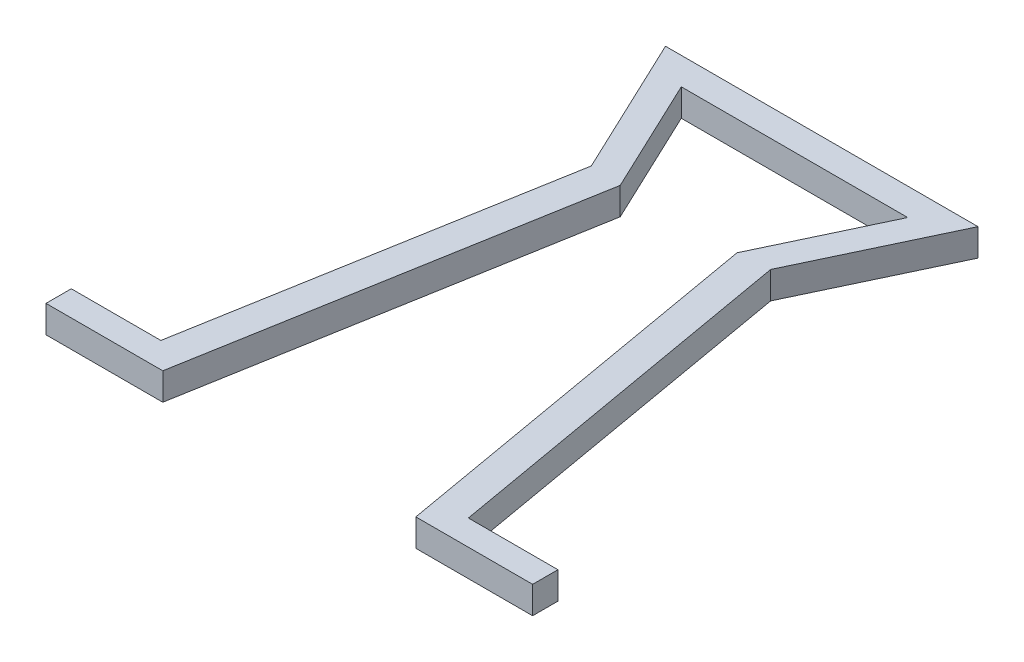
ISO-10303-21;
HEADER;
FILE_DESCRIPTION(('STEP AP214'),'2;1');
FILE_NAME('part.step','',(''),(''),'','','');
FILE_SCHEMA(('AUTOMOTIVE_DESIGN { 1 0 10303 214 1 1 1 1 }'));
ENDSEC;
DATA;
#1=APPLICATION_CONTEXT('core data for automotive mechanical design processes');
#2=APPLICATION_PROTOCOL_DEFINITION('international standard','automotive_design',2000,#1);
#3=PRODUCT_CONTEXT('',#1,'mechanical');
#4=PRODUCT('Part','Part','',(#3));
#5=PRODUCT_RELATED_PRODUCT_CATEGORY('part','',(#4));
#6=PRODUCT_DEFINITION_FORMATION('','',#4);
#7=PRODUCT_DEFINITION_CONTEXT('part definition',#1,'design');
#8=PRODUCT_DEFINITION('design','',#6,#7);
#9=PRODUCT_DEFINITION_SHAPE('','',#8);
#10=(LENGTH_UNIT() NAMED_UNIT(*) SI_UNIT(.MILLI.,.METRE.));
#11=(NAMED_UNIT(*) PLANE_ANGLE_UNIT() SI_UNIT($,.RADIAN.));
#12=(NAMED_UNIT(*) SI_UNIT($,.STERADIAN.) SOLID_ANGLE_UNIT());
#13=UNCERTAINTY_MEASURE_WITH_UNIT(LENGTH_MEASURE(1.E-05),#10,'distance_accuracy_value','');
#14=(GEOMETRIC_REPRESENTATION_CONTEXT(3) GLOBAL_UNCERTAINTY_ASSIGNED_CONTEXT((#13)) GLOBAL_UNIT_ASSIGNED_CONTEXT((#10,
#11,#12)) REPRESENTATION_CONTEXT('',''));
#15=CARTESIAN_POINT('',(0.,0.,0.));
#16=DIRECTION('',(0.,0.,1.));
#17=DIRECTION('',(1.,0.,0.));
#18=AXIS2_PLACEMENT_3D('',#15,#16,#17);
#19=CARTESIAN_POINT('',(-15.24,1.778,-1.651));
#20=DIRECTION('',(1.,0.,0.));
#21=DIRECTION('',(0.,0.,-1.));
#22=AXIS2_PLACEMENT_3D('',#19,#20,#21);
#23=PLANE('',#22);
#24=DIRECTION('',(0.,0.,1.));
#25=VECTOR('',#24,1.);
#26=CARTESIAN_POINT('',(-15.24,0.,-1.651));
#27=LINE('',#26,#25);
#28=CARTESIAN_POINT('',(-15.24,0.,-1.651));
#29=VERTEX_POINT('',#28);
#30=CARTESIAN_POINT('',(-15.24,0.,0.));
#31=VERTEX_POINT('',#30);
#32=EDGE_CURVE('E188',#29,#31,#27,.T.);
#33=ORIENTED_EDGE('',*,*,#32,.T.);
#34=DIRECTION('',(0.,-1.,0.));
#35=VECTOR('',#34,1.);
#36=CARTESIAN_POINT('',(-15.24,1.778,0.));
#37=LINE('',#36,#35);
#38=CARTESIAN_POINT('',(-15.24,1.778,0.));
#39=VERTEX_POINT('',#38);
#40=EDGE_CURVE('E11',#39,#31,#37,.T.);
#41=ORIENTED_EDGE('',*,*,#40,.F.);
#42=DIRECTION('',(0.,0.,1.));
#43=VECTOR('',#42,1.);
#44=CARTESIAN_POINT('',(-15.24,1.778,-1.651));
#45=LINE('',#44,#43);
#46=CARTESIAN_POINT('',(-15.24,1.778,-1.651));
#47=VERTEX_POINT('',#46);
#48=EDGE_CURVE('E234',#47,#39,#45,.T.);
#49=ORIENTED_EDGE('',*,*,#48,.F.);
#50=DIRECTION('',(0.,-1.,0.));
#51=VECTOR('',#50,1.);
#52=CARTESIAN_POINT('',(-15.24,1.778,-1.651));
#53=LINE('',#52,#51);
#54=EDGE_CURVE('E184',#47,#29,#53,.T.);
#55=ORIENTED_EDGE('',*,*,#54,.T.);
#56=EDGE_LOOP('',(#33,#41,#49,#55));
#57=FACE_BOUND('',#56,.T.);
#58=ADVANCED_FACE('F39',(#57),#23,.F.);
#59=CARTESIAN_POINT('',(-15.24,1.778,0.));
#60=DIRECTION('',(0.,0.,-1.));
#61=DIRECTION('',(-1.,0.,0.));
#62=AXIS2_PLACEMENT_3D('',#59,#60,#61);
#63=PLANE('',#62);
#64=DIRECTION('',(1.,0.,0.));
#65=VECTOR('',#64,1.);
#66=CARTESIAN_POINT('',(-15.24,0.,0.));
#67=LINE('',#66,#65);
#68=CARTESIAN_POINT('',(-7.62,0.,0.));
#69=VERTEX_POINT('',#68);
#70=EDGE_CURVE('E192',#31,#69,#67,.T.);
#71=ORIENTED_EDGE('',*,*,#70,.T.);
#72=DIRECTION('',(0.,-1.,0.));
#73=VECTOR('',#72,1.);
#74=CARTESIAN_POINT('',(-7.62,1.778,0.));
#75=LINE('',#74,#73);
#76=CARTESIAN_POINT('',(-7.62,1.778,0.));
#77=VERTEX_POINT('',#76);
#78=EDGE_CURVE('E48',#77,#69,#75,.T.);
#79=ORIENTED_EDGE('',*,*,#78,.F.);
#80=DIRECTION('',(1.,0.,0.));
#81=VECTOR('',#80,1.);
#82=CARTESIAN_POINT('',(-15.24,1.778,0.));
#83=LINE('',#82,#81);
#84=EDGE_CURVE('E123',#39,#77,#83,.T.);
#85=ORIENTED_EDGE('',*,*,#84,.F.);
#86=ORIENTED_EDGE('',*,*,#40,.T.);
#87=EDGE_LOOP('',(#71,#79,#85,#86));
#88=FACE_BOUND('',#87,.T.);
#89=ADVANCED_FACE('F356',(#88),#63,.F.);
#90=CARTESIAN_POINT('',(-7.62,1.778,0.));
#91=DIRECTION('',(-0.985030467155704,0.,-0.172380331752248));
#92=DIRECTION('',(-0.172380331752248,0.,0.985030467155704));
#93=AXIS2_PLACEMENT_3D('',#90,#91,#92);
#94=PLANE('',#93);
#95=DIRECTION('',(0.172380331752248,0.,-0.985030467155704));
#96=VECTOR('',#95,1.);
#97=CARTESIAN_POINT('',(-7.62,0.,0.));
#98=LINE('',#97,#96);
#99=CARTESIAN_POINT('',(-3.175,0.,-25.4));
#100=VERTEX_POINT('',#99);
#101=EDGE_CURVE('E195',#69,#100,#98,.T.);
#102=ORIENTED_EDGE('',*,*,#101,.T.);
#103=DIRECTION('',(0.,-1.,0.));
#104=VECTOR('',#103,1.);
#105=CARTESIAN_POINT('',(-3.175,1.778,-25.4));
#106=LINE('',#105,#104);
#107=CARTESIAN_POINT('',(-3.175,1.778,-25.4));
#108=VERTEX_POINT('',#107);
#109=EDGE_CURVE('E277',#108,#100,#106,.T.);
#110=ORIENTED_EDGE('',*,*,#109,.F.);
#111=DIRECTION('',(0.172380331752248,0.,-0.985030467155704));
#112=VECTOR('',#111,1.);
#113=CARTESIAN_POINT('',(-7.62,1.778,0.));
#114=LINE('',#113,#112);
#115=EDGE_CURVE('E287',#77,#108,#114,.T.);
#116=ORIENTED_EDGE('',*,*,#115,.F.);
#117=ORIENTED_EDGE('',*,*,#78,.T.);
#118=EDGE_LOOP('',(#102,#110,#116,#117));
#119=FACE_BOUND('',#118,.T.);
#120=ADVANCED_FACE('F285',(#119),#94,.F.);
#121=CARTESIAN_POINT('',(-3.175,1.778,-25.4));
#122=DIRECTION('',(-0.903960632583604,0.,0.427615685796312));
#123=DIRECTION('',(0.427615685796312,0.,0.903960632583604));
#124=AXIS2_PLACEMENT_3D('',#121,#122,#123);
#125=PLANE('',#124);
#126=DIRECTION('',(-0.427615685796312,0.,-0.903960632583604));
#127=VECTOR('',#126,1.);
#128=CARTESIAN_POINT('',(-3.175,0.,-25.4));
#129=LINE('',#128,#127);
#130=CARTESIAN_POINT('',(-6.75151231719064,0.,-32.9605887344149));
#131=VERTEX_POINT('',#130);
#132=EDGE_CURVE('E198',#100,#131,#129,.T.);
#133=ORIENTED_EDGE('',*,*,#132,.T.);
#134=DIRECTION('',(0.,-1.,0.));
#135=VECTOR('',#134,1.);
#136=CARTESIAN_POINT('',(-6.75151231719064,1.778,-32.9605887344149));
#137=LINE('',#136,#135);
#138=CARTESIAN_POINT('',(-6.75151231719064,1.778,-32.9605887344149));
#139=VERTEX_POINT('',#138);
#140=EDGE_CURVE('E273',#139,#131,#137,.T.);
#141=ORIENTED_EDGE('',*,*,#140,.F.);
#142=DIRECTION('',(-0.427615685796312,0.,-0.903960632583604));
#143=VECTOR('',#142,1.);
#144=CARTESIAN_POINT('',(-3.175,1.778,-25.4));
#145=LINE('',#144,#143);
#146=EDGE_CURVE('E306',#108,#139,#145,.T.);
#147=ORIENTED_EDGE('',*,*,#146,.F.);
#148=ORIENTED_EDGE('',*,*,#109,.T.);
#149=EDGE_LOOP('',(#133,#141,#147,#148));
#150=FACE_BOUND('',#149,.T.);
#151=ADVANCED_FACE('F296',(#150),#125,.F.);
#152=CARTESIAN_POINT('',(8.02151231719064,1.778,-32.9605887344149));
#153=DIRECTION('',(0.,0.,-1.));
#154=DIRECTION('',(-1.,0.,0.));
#155=AXIS2_PLACEMENT_3D('',#152,#153,#154);
#156=PLANE('',#155);
#157=DIRECTION('',(1.,0.,0.));
#158=VECTOR('',#157,1.);
#159=CARTESIAN_POINT('',(8.02151231719064,0.,-32.9605887344149));
#160=LINE('',#159,#158);
#161=CARTESIAN_POINT('',(8.02151231719064,0.,-32.9605887344149));
#162=VERTEX_POINT('',#161);
#163=EDGE_CURVE('E201',#131,#162,#160,.T.);
#164=ORIENTED_EDGE('',*,*,#163,.T.);
#165=DIRECTION('',(0.,-1.,0.));
#166=VECTOR('',#165,1.);
#167=CARTESIAN_POINT('',(8.02151231719064,1.778,-32.9605887344149));
#168=LINE('',#167,#166);
#169=CARTESIAN_POINT('',(8.02151231719064,1.778,-32.9605887344149));
#170=VERTEX_POINT('',#169);
#171=EDGE_CURVE('E269',#170,#162,#168,.T.);
#172=ORIENTED_EDGE('',*,*,#171,.F.);
#173=DIRECTION('',(1.,0.,0.));
#174=VECTOR('',#173,1.);
#175=CARTESIAN_POINT('',(8.02151231719064,1.778,-32.9605887344149));
#176=LINE('',#175,#174);
#177=EDGE_CURVE('E302',#139,#170,#176,.T.);
#178=ORIENTED_EDGE('',*,*,#177,.F.);
#179=ORIENTED_EDGE('',*,*,#140,.T.);
#180=EDGE_LOOP('',(#164,#172,#178,#179));
#181=FACE_BOUND('',#180,.T.);
#182=ADVANCED_FACE('F300',(#181),#156,.F.);
#183=CARTESIAN_POINT('',(4.445,1.778,-25.4));
#184=DIRECTION('',(0.903960632583604,0.,0.427615685796312));
#185=DIRECTION('',(0.427615685796312,0.,-0.903960632583604));
#186=AXIS2_PLACEMENT_3D('',#183,#184,#185);
#187=PLANE('',#186);
#188=DIRECTION('',(-0.427615685796312,0.,0.903960632583604));
#189=VECTOR('',#188,1.);
#190=CARTESIAN_POINT('',(4.445,0.,-25.4));
#191=LINE('',#190,#189);
#192=CARTESIAN_POINT('',(4.445,0.,-25.4));
#193=VERTEX_POINT('',#192);
#194=EDGE_CURVE('E204',#162,#193,#191,.T.);
#195=ORIENTED_EDGE('',*,*,#194,.T.);
#196=DIRECTION('',(0.,-1.,0.));
#197=VECTOR('',#196,1.);
#198=CARTESIAN_POINT('',(4.445,1.778,-25.4));
#199=LINE('',#198,#197);
#200=CARTESIAN_POINT('',(4.445,1.778,-25.4));
#201=VERTEX_POINT('',#200);
#202=EDGE_CURVE('E265',#201,#193,#199,.T.);
#203=ORIENTED_EDGE('',*,*,#202,.F.);
#204=DIRECTION('',(-0.427615685796312,0.,0.903960632583604));
#205=VECTOR('',#204,1.);
#206=CARTESIAN_POINT('',(4.445,1.778,-25.4));
#207=LINE('',#206,#205);
#208=EDGE_CURVE('E305',#170,#201,#207,.T.);
#209=ORIENTED_EDGE('',*,*,#208,.F.);
#210=ORIENTED_EDGE('',*,*,#171,.T.);
#211=EDGE_LOOP('',(#195,#203,#209,#210));
#212=FACE_BOUND('',#211,.T.);
#213=ADVANCED_FACE('F369',(#212),#187,.F.);
#214=CARTESIAN_POINT('',(4.445,1.778,-25.4));
#215=DIRECTION('',(0.985030467155704,0.,-0.172380331752248));
#216=DIRECTION('',(-0.172380331752248,0.,-0.985030467155704));
#217=AXIS2_PLACEMENT_3D('',#214,#215,#216);
#218=PLANE('',#217);
#219=DIRECTION('',(0.172380331752248,0.,0.985030467155704));
#220=VECTOR('',#219,1.);
#221=CARTESIAN_POINT('',(4.445,0.,-25.4));
#222=LINE('',#221,#220);
#223=CARTESIAN_POINT('',(8.89,0.,0.));
#224=VERTEX_POINT('',#223);
#225=EDGE_CURVE('E207',#193,#224,#222,.T.);
#226=ORIENTED_EDGE('',*,*,#225,.T.);
#227=DIRECTION('',(0.,-1.,0.));
#228=VECTOR('',#227,1.);
#229=CARTESIAN_POINT('',(8.89,1.778,0.));
#230=LINE('',#229,#228);
#231=CARTESIAN_POINT('',(8.89,1.778,0.));
#232=VERTEX_POINT('',#231);
#233=EDGE_CURVE('E261',#232,#224,#230,.T.);
#234=ORIENTED_EDGE('',*,*,#233,.F.);
#235=DIRECTION('',(0.172380331752248,0.,0.985030467155704));
#236=VECTOR('',#235,1.);
#237=CARTESIAN_POINT('',(4.445,1.778,-25.4));
#238=LINE('',#237,#236);
#239=EDGE_CURVE('E310',#201,#232,#238,.T.);
#240=ORIENTED_EDGE('',*,*,#239,.F.);
#241=ORIENTED_EDGE('',*,*,#202,.T.);
#242=EDGE_LOOP('',(#226,#234,#240,#241));
#243=FACE_BOUND('',#242,.T.);
#244=ADVANCED_FACE('F372',(#243),#218,.F.);
#245=CARTESIAN_POINT('',(8.89,1.778,0.));
#246=DIRECTION('',(0.,0.,-1.));
#247=DIRECTION('',(-1.,0.,0.));
#248=AXIS2_PLACEMENT_3D('',#245,#246,#247);
#249=PLANE('',#248);
#250=DIRECTION('',(1.,0.,0.));
#251=VECTOR('',#250,1.);
#252=CARTESIAN_POINT('',(8.89,0.,0.));
#253=LINE('',#252,#251);
#254=CARTESIAN_POINT('',(16.51,0.,0.));
#255=VERTEX_POINT('',#254);
#256=EDGE_CURVE('E210',#224,#255,#253,.T.);
#257=ORIENTED_EDGE('',*,*,#256,.T.);
#258=DIRECTION('',(0.,-1.,0.));
#259=VECTOR('',#258,1.);
#260=CARTESIAN_POINT('',(16.51,1.778,0.));
#261=LINE('',#260,#259);
#262=CARTESIAN_POINT('',(16.51,1.778,0.));
#263=VERTEX_POINT('',#262);
#264=EDGE_CURVE('E257',#263,#255,#261,.T.);
#265=ORIENTED_EDGE('',*,*,#264,.F.);
#266=DIRECTION('',(1.,0.,0.));
#267=VECTOR('',#266,1.);
#268=CARTESIAN_POINT('',(8.89,1.778,0.));
#269=LINE('',#268,#267);
#270=EDGE_CURVE('E317',#232,#263,#269,.T.);
#271=ORIENTED_EDGE('',*,*,#270,.F.);
#272=ORIENTED_EDGE('',*,*,#233,.T.);
#273=EDGE_LOOP('',(#257,#265,#271,#272));
#274=FACE_BOUND('',#273,.T.);
#275=ADVANCED_FACE('F376',(#274),#249,.F.);
#276=CARTESIAN_POINT('',(16.51,1.778,0.));
#277=DIRECTION('',(-1.,0.,0.));
#278=DIRECTION('',(0.,0.,1.));
#279=AXIS2_PLACEMENT_3D('',#276,#277,#278);
#280=PLANE('',#279);
#281=DIRECTION('',(0.,0.,-1.));
#282=VECTOR('',#281,1.);
#283=CARTESIAN_POINT('',(16.51,0.,0.));
#284=LINE('',#283,#282);
#285=CARTESIAN_POINT('',(16.51,0.,-1.651));
#286=VERTEX_POINT('',#285);
#287=EDGE_CURVE('E213',#255,#286,#284,.T.);
#288=ORIENTED_EDGE('',*,*,#287,.T.);
#289=DIRECTION('',(0.,-1.,0.));
#290=VECTOR('',#289,1.);
#291=CARTESIAN_POINT('',(16.51,1.778,-1.651));
#292=LINE('',#291,#290);
#293=CARTESIAN_POINT('',(16.51,1.778,-1.651));
#294=VERTEX_POINT('',#293);
#295=EDGE_CURVE('E253',#294,#286,#292,.T.);
#296=ORIENTED_EDGE('',*,*,#295,.F.);
#297=DIRECTION('',(0.,0.,-1.));
#298=VECTOR('',#297,1.);
#299=CARTESIAN_POINT('',(16.51,1.778,0.));
#300=LINE('',#299,#298);
#301=EDGE_CURVE('E320',#263,#294,#300,.T.);
#302=ORIENTED_EDGE('',*,*,#301,.F.);
#303=ORIENTED_EDGE('',*,*,#264,.T.);
#304=EDGE_LOOP('',(#288,#296,#302,#303));
#305=FACE_BOUND('',#304,.T.);
#306=ADVANCED_FACE('F380',(#305),#280,.F.);
#307=CARTESIAN_POINT('',(16.51,1.778,-1.651));
#308=DIRECTION('',(0.,0.,1.));
#309=DIRECTION('',(1.,0.,0.));
#310=AXIS2_PLACEMENT_3D('',#307,#308,#309);
#311=PLANE('',#310);
#312=DIRECTION('',(-1.,0.,0.));
#313=VECTOR('',#312,1.);
#314=CARTESIAN_POINT('',(16.51,0.,-1.651));
#315=LINE('',#314,#313);
#316=CARTESIAN_POINT('',(10.668,0.,-1.651));
#317=VERTEX_POINT('',#316);
#318=EDGE_CURVE('E216',#286,#317,#315,.T.);
#319=ORIENTED_EDGE('',*,*,#318,.T.);
#320=DIRECTION('',(0.,-1.,0.));
#321=VECTOR('',#320,1.);
#322=CARTESIAN_POINT('',(10.668,1.778,-1.651));
#323=LINE('',#322,#321);
#324=CARTESIAN_POINT('',(10.668,1.778,-1.651));
#325=VERTEX_POINT('',#324);
#326=EDGE_CURVE('E249',#325,#317,#323,.T.);
#327=ORIENTED_EDGE('',*,*,#326,.F.);
#328=DIRECTION('',(-1.,0.,0.));
#329=VECTOR('',#328,1.);
#330=CARTESIAN_POINT('',(16.51,1.778,-1.651));
#331=LINE('',#330,#329);
#332=EDGE_CURVE('E323',#294,#325,#331,.T.);
#333=ORIENTED_EDGE('',*,*,#332,.F.);
#334=ORIENTED_EDGE('',*,*,#295,.T.);
#335=EDGE_LOOP('',(#319,#327,#333,#334));
#336=FACE_BOUND('',#335,.T.);
#337=ADVANCED_FACE('F384',(#336),#311,.F.);
#338=CARTESIAN_POINT('',(10.668,1.778,-1.651));
#339=DIRECTION('',(-0.985030467155704,0.,0.172380331752248));
#340=DIRECTION('',(0.172380331752248,0.,0.985030467155704));
#341=AXIS2_PLACEMENT_3D('',#338,#339,#340);
#342=PLANE('',#341);
#343=DIRECTION('',(-0.172380331752248,0.,-0.985030467155704));
#344=VECTOR('',#343,1.);
#345=CARTESIAN_POINT('',(10.668,0.,-1.651));
#346=LINE('',#345,#344);
#347=CARTESIAN_POINT('',(6.48491397621103,0.,-25.5543487073655));
#348=VERTEX_POINT('',#347);
#349=EDGE_CURVE('E219',#317,#348,#346,.T.);
#350=ORIENTED_EDGE('',*,*,#349,.T.);
#351=DIRECTION('',(0.,-1.,0.));
#352=VECTOR('',#351,1.);
#353=CARTESIAN_POINT('',(6.48491397621103,1.778,-25.5543487073655));
#354=LINE('',#353,#352);
#355=CARTESIAN_POINT('',(6.48491397621103,1.778,-25.5543487073655));
#356=VERTEX_POINT('',#355);
#357=EDGE_CURVE('E245',#356,#348,#354,.T.);
#358=ORIENTED_EDGE('',*,*,#357,.F.);
#359=DIRECTION('',(-0.172380331752248,0.,-0.985030467155704));
#360=VECTOR('',#359,1.);
#361=CARTESIAN_POINT('',(10.668,1.778,-1.651));
#362=LINE('',#361,#360);
#363=EDGE_CURVE('E326',#325,#356,#362,.T.);
#364=ORIENTED_EDGE('',*,*,#363,.F.);
#365=ORIENTED_EDGE('',*,*,#326,.T.);
#366=EDGE_LOOP('',(#350,#358,#364,#365));
#367=FACE_BOUND('',#366,.T.);
#368=ADVANCED_FACE('F388',(#367),#342,.F.);
#369=CARTESIAN_POINT('',(6.48491397621103,1.778,-25.5543487073655));
#370=DIRECTION('',(-0.903960632583604,0.,-0.427615685796312));
#371=DIRECTION('',(-0.427615685796312,0.,0.903960632583604));
#372=AXIS2_PLACEMENT_3D('',#369,#370,#371);
#373=PLANE('',#372);
#374=DIRECTION('',(0.427615685796312,0.,-0.903960632583604));
#375=VECTOR('',#374,1.);
#376=CARTESIAN_POINT('',(6.48491397621103,0.,-25.5543487073655));
#377=LINE('',#376,#375);
#378=CARTESIAN_POINT('',(10.8294893439016,0.,-34.7385887344149));
#379=VERTEX_POINT('',#378);
#380=EDGE_CURVE('E222',#348,#379,#377,.T.);
#381=ORIENTED_EDGE('',*,*,#380,.T.);
#382=DIRECTION('',(0.,-1.,0.));
#383=VECTOR('',#382,1.);
#384=CARTESIAN_POINT('',(10.8294893439016,1.778,-34.7385887344149));
#385=LINE('',#384,#383);
#386=CARTESIAN_POINT('',(10.8294893439016,1.778,-34.7385887344149));
#387=VERTEX_POINT('',#386);
#388=EDGE_CURVE('E241',#387,#379,#385,.T.);
#389=ORIENTED_EDGE('',*,*,#388,.F.);
#390=DIRECTION('',(0.427615685796312,0.,-0.903960632583604));
#391=VECTOR('',#390,1.);
#392=CARTESIAN_POINT('',(6.48491397621103,1.778,-25.5543487073655));
#393=LINE('',#392,#391);
#394=EDGE_CURVE('E329',#356,#387,#393,.T.);
#395=ORIENTED_EDGE('',*,*,#394,.F.);
#396=ORIENTED_EDGE('',*,*,#357,.T.);
#397=EDGE_LOOP('',(#381,#389,#395,#396));
#398=FACE_BOUND('',#397,.T.);
#399=ADVANCED_FACE('F337',(#398),#373,.F.);
#400=CARTESIAN_POINT('',(-9.55948934390157,1.778,-34.7385887344149));
#401=DIRECTION('',(0.,0.,1.));
#402=DIRECTION('',(1.,0.,0.));
#403=AXIS2_PLACEMENT_3D('',#400,#401,#402);
#404=PLANE('',#403);
#405=DIRECTION('',(-1.,0.,0.));
#406=VECTOR('',#405,1.);
#407=CARTESIAN_POINT('',(-9.55948934390157,0.,-34.7385887344149));
#408=LINE('',#407,#406);
#409=CARTESIAN_POINT('',(-9.55948934390157,0.,-34.7385887344149));
#410=VERTEX_POINT('',#409);
#411=EDGE_CURVE('E225',#379,#410,#408,.T.);
#412=ORIENTED_EDGE('',*,*,#411,.T.);
#413=DIRECTION('',(0.,-1.,0.));
#414=VECTOR('',#413,1.);
#415=CARTESIAN_POINT('',(-9.55948934390157,1.778,-34.7385887344149));
#416=LINE('',#415,#414);
#417=CARTESIAN_POINT('',(-9.55948934390157,1.778,-34.7385887344149));
#418=VERTEX_POINT('',#417);
#419=EDGE_CURVE('E177',#418,#410,#416,.T.);
#420=ORIENTED_EDGE('',*,*,#419,.F.);
#421=DIRECTION('',(-1.,0.,0.));
#422=VECTOR('',#421,1.);
#423=CARTESIAN_POINT('',(-9.55948934390157,1.778,-34.7385887344149));
#424=LINE('',#423,#422);
#425=EDGE_CURVE('E166',#387,#418,#424,.T.);
#426=ORIENTED_EDGE('',*,*,#425,.F.);
#427=ORIENTED_EDGE('',*,*,#388,.T.);
#428=EDGE_LOOP('',(#412,#420,#426,#427));
#429=FACE_BOUND('',#428,.T.);
#430=ADVANCED_FACE('F341',(#429),#404,.F.);
#431=CARTESIAN_POINT('',(-5.21491397621104,1.778,-25.5543487073655));
#432=DIRECTION('',(0.903960632583604,0.,-0.427615685796312));
#433=DIRECTION('',(-0.427615685796312,0.,-0.903960632583604));
#434=AXIS2_PLACEMENT_3D('',#431,#432,#433);
#435=PLANE('',#434);
#436=DIRECTION('',(0.427615685796312,0.,0.903960632583604));
#437=VECTOR('',#436,1.);
#438=CARTESIAN_POINT('',(-5.21491397621104,0.,-25.5543487073655));
#439=LINE('',#438,#437);
#440=CARTESIAN_POINT('',(-5.21491397621104,0.,-25.5543487073655));
#441=VERTEX_POINT('',#440);
#442=EDGE_CURVE('E175',#410,#441,#439,.T.);
#443=ORIENTED_EDGE('',*,*,#442,.T.);
#444=DIRECTION('',(0.,-1.,0.));
#445=VECTOR('',#444,1.);
#446=CARTESIAN_POINT('',(-5.21491397621104,1.778,-25.5543487073655));
#447=LINE('',#446,#445);
#448=CARTESIAN_POINT('',(-5.21491397621104,1.778,-25.5543487073655));
#449=VERTEX_POINT('',#448);
#450=EDGE_CURVE('E172',#449,#441,#447,.T.);
#451=ORIENTED_EDGE('',*,*,#450,.F.);
#452=DIRECTION('',(0.427615685796312,0.,0.903960632583604));
#453=VECTOR('',#452,1.);
#454=CARTESIAN_POINT('',(-5.21491397621104,1.778,-25.5543487073655));
#455=LINE('',#454,#453);
#456=EDGE_CURVE('E160',#418,#449,#455,.T.);
#457=ORIENTED_EDGE('',*,*,#456,.F.);
#458=ORIENTED_EDGE('',*,*,#419,.T.);
#459=EDGE_LOOP('',(#443,#451,#457,#458));
#460=FACE_BOUND('',#459,.T.);
#461=ADVANCED_FACE('F173',(#460),#435,.F.);
#462=CARTESIAN_POINT('',(-9.398,1.778,-1.651));
#463=DIRECTION('',(0.985030467155704,0.,0.172380331752248));
#464=DIRECTION('',(0.172380331752248,0.,-0.985030467155704));
#465=AXIS2_PLACEMENT_3D('',#462,#463,#464);
#466=PLANE('',#465);
#467=DIRECTION('',(-0.172380331752248,0.,0.985030467155704));
#468=VECTOR('',#467,1.);
#469=CARTESIAN_POINT('',(-9.398,0.,-1.651));
#470=LINE('',#469,#468);
#471=CARTESIAN_POINT('',(-9.398,0.,-1.651));
#472=VERTEX_POINT('',#471);
#473=EDGE_CURVE('E109',#441,#472,#470,.T.);
#474=ORIENTED_EDGE('',*,*,#473,.T.);
#475=DIRECTION('',(0.,-1.,0.));
#476=VECTOR('',#475,1.);
#477=CARTESIAN_POINT('',(-9.398,1.778,-1.651));
#478=LINE('',#477,#476);
#479=CARTESIAN_POINT('',(-9.398,1.778,-1.651));
#480=VERTEX_POINT('',#479);
#481=EDGE_CURVE('E178',#480,#472,#478,.T.);
#482=ORIENTED_EDGE('',*,*,#481,.F.);
#483=DIRECTION('',(-0.172380331752248,0.,0.985030467155704));
#484=VECTOR('',#483,1.);
#485=CARTESIAN_POINT('',(-9.398,1.778,-1.651));
#486=LINE('',#485,#484);
#487=EDGE_CURVE('E164',#449,#480,#486,.T.);
#488=ORIENTED_EDGE('',*,*,#487,.F.);
#489=ORIENTED_EDGE('',*,*,#450,.T.);
#490=EDGE_LOOP('',(#474,#482,#488,#489));
#491=FACE_BOUND('',#490,.T.);
#492=ADVANCED_FACE('F180',(#491),#466,.F.);
#493=CARTESIAN_POINT('',(-9.398,1.778,-1.651));
#494=DIRECTION('',(0.,0.,1.));
#495=DIRECTION('',(1.,0.,0.));
#496=AXIS2_PLACEMENT_3D('',#493,#494,#495);
#497=PLANE('',#496);
#498=DIRECTION('',(-1.,0.,0.));
#499=VECTOR('',#498,1.);
#500=CARTESIAN_POINT('',(-9.398,0.,-1.651));
#501=LINE('',#500,#499);
#502=EDGE_CURVE('E115',#472,#29,#501,.T.);
#503=ORIENTED_EDGE('',*,*,#502,.T.);
#504=ORIENTED_EDGE('',*,*,#54,.F.);
#505=DIRECTION('',(-1.,0.,0.));
#506=VECTOR('',#505,1.);
#507=CARTESIAN_POINT('',(-9.398,1.778,-1.651));
#508=LINE('',#507,#506);
#509=EDGE_CURVE('E56',#480,#47,#508,.T.);
#510=ORIENTED_EDGE('',*,*,#509,.F.);
#511=ORIENTED_EDGE('',*,*,#481,.T.);
#512=EDGE_LOOP('',(#503,#504,#510,#511));
#513=FACE_BOUND('',#512,.T.);
#514=ADVANCED_FACE('F345',(#513),#497,.F.);
#515=CARTESIAN_POINT('',(0.,1.778,0.));
#516=DIRECTION('',(0.,1.,0.));
#517=DIRECTION('',(0.,0.,1.));
#518=AXIS2_PLACEMENT_3D('',#515,#516,#517);
#519=PLANE('',#518);
#520=ORIENTED_EDGE('',*,*,#48,.T.);
#521=ORIENTED_EDGE('',*,*,#84,.T.);
#522=ORIENTED_EDGE('',*,*,#115,.T.);
#523=ORIENTED_EDGE('',*,*,#146,.T.);
#524=ORIENTED_EDGE('',*,*,#177,.T.);
#525=ORIENTED_EDGE('',*,*,#208,.T.);
#526=ORIENTED_EDGE('',*,*,#239,.T.);
#527=ORIENTED_EDGE('',*,*,#270,.T.);
#528=ORIENTED_EDGE('',*,*,#301,.T.);
#529=ORIENTED_EDGE('',*,*,#332,.T.);
#530=ORIENTED_EDGE('',*,*,#363,.T.);
#531=ORIENTED_EDGE('',*,*,#394,.T.);
#532=ORIENTED_EDGE('',*,*,#425,.T.);
#533=ORIENTED_EDGE('',*,*,#456,.T.);
#534=ORIENTED_EDGE('',*,*,#487,.T.);
#535=ORIENTED_EDGE('',*,*,#509,.T.);
#536=EDGE_LOOP('',(#520,#521,#522,#523,#524,#525,#526,#527,#528,#529,#530,#531,#532,#533,#534,#535));
#537=FACE_BOUND('',#536,.T.);
#538=ADVANCED_FACE('F162',(#537),#519,.T.);
#539=CARTESIAN_POINT('',(0.,0.,0.));
#540=DIRECTION('',(0.,1.,0.));
#541=DIRECTION('',(0.,0.,1.));
#542=AXIS2_PLACEMENT_3D('',#539,#540,#541);
#543=PLANE('',#542);
#544=ORIENTED_EDGE('',*,*,#32,.F.);
#545=ORIENTED_EDGE('',*,*,#502,.F.);
#546=ORIENTED_EDGE('',*,*,#473,.F.);
#547=ORIENTED_EDGE('',*,*,#442,.F.);
#548=ORIENTED_EDGE('',*,*,#411,.F.);
#549=ORIENTED_EDGE('',*,*,#380,.F.);
#550=ORIENTED_EDGE('',*,*,#349,.F.);
#551=ORIENTED_EDGE('',*,*,#318,.F.);
#552=ORIENTED_EDGE('',*,*,#287,.F.);
#553=ORIENTED_EDGE('',*,*,#256,.F.);
#554=ORIENTED_EDGE('',*,*,#225,.F.);
#555=ORIENTED_EDGE('',*,*,#194,.F.);
#556=ORIENTED_EDGE('',*,*,#163,.F.);
#557=ORIENTED_EDGE('',*,*,#132,.F.);
#558=ORIENTED_EDGE('',*,*,#101,.F.);
#559=ORIENTED_EDGE('',*,*,#70,.F.);
#560=EDGE_LOOP('',(#544,#545,#546,#547,#548,#549,#550,#551,#552,#553,#554,#555,#556,#557,#558,#559));
#561=FACE_BOUND('',#560,.T.);
#562=ADVANCED_FACE('F291',(#561),#543,.F.);
#563=CLOSED_SHELL('',(#58,#89,#120,#151,#182,#213,#244,#275,#306,#337,#368,#399,#430,#461,#492,
#514,#538,#562));
#564=MANIFOLD_SOLID_BREP('B2',#563);
#565=ADVANCED_BREP_SHAPE_REPRESENTATION('',(#18,#564),#14);
#566=SHAPE_DEFINITION_REPRESENTATION(#9,#565);
ENDSEC;
END-ISO-10303-21;
